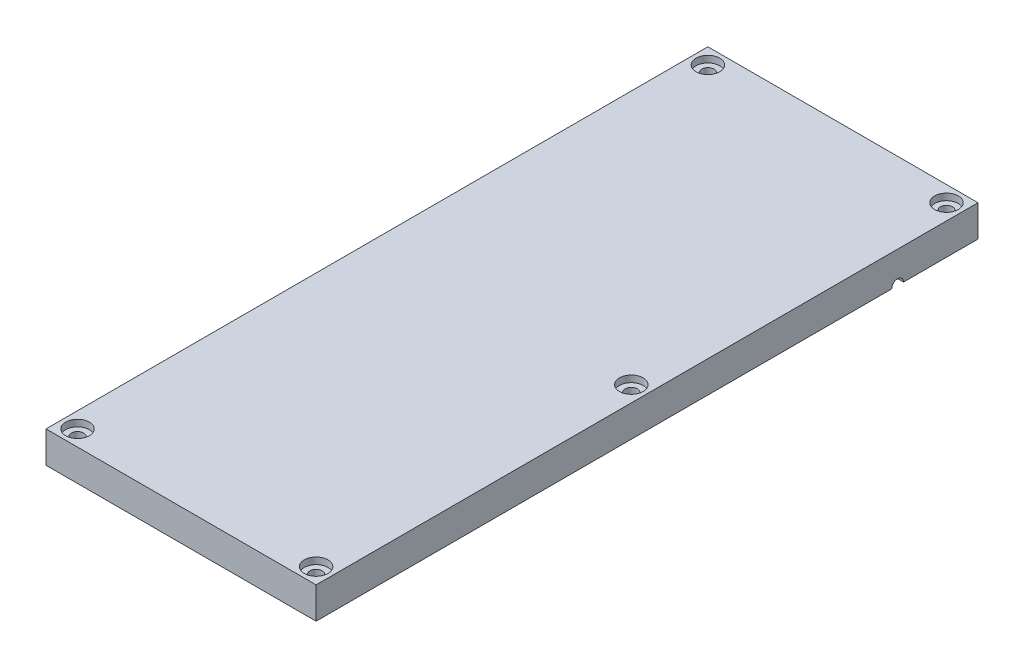
ISO-10303-21;
HEADER;
FILE_DESCRIPTION(('STEP AP214'),'2;1');
FILE_NAME('part.step','',(''),(''),'','','');
FILE_SCHEMA(('AUTOMOTIVE_DESIGN { 1 0 10303 214 1 1 1 1 }'));
ENDSEC;
DATA;
#1=APPLICATION_CONTEXT('core data for automotive mechanical design processes');
#2=APPLICATION_PROTOCOL_DEFINITION('international standard','automotive_design',2000,#1);
#3=PRODUCT_CONTEXT('',#1,'mechanical');
#4=PRODUCT('Part','Part','',(#3));
#5=PRODUCT_RELATED_PRODUCT_CATEGORY('part','',(#4));
#6=PRODUCT_DEFINITION_FORMATION('','',#4);
#7=PRODUCT_DEFINITION_CONTEXT('part definition',#1,'design');
#8=PRODUCT_DEFINITION('design','',#6,#7);
#9=PRODUCT_DEFINITION_SHAPE('','',#8);
#10=(LENGTH_UNIT() NAMED_UNIT(*) SI_UNIT(.MILLI.,.METRE.));
#11=(NAMED_UNIT(*) PLANE_ANGLE_UNIT() SI_UNIT($,.RADIAN.));
#12=(NAMED_UNIT(*) SI_UNIT($,.STERADIAN.) SOLID_ANGLE_UNIT());
#13=UNCERTAINTY_MEASURE_WITH_UNIT(LENGTH_MEASURE(1.E-05),#10,'distance_accuracy_value','');
#14=(GEOMETRIC_REPRESENTATION_CONTEXT(3) GLOBAL_UNCERTAINTY_ASSIGNED_CONTEXT((#13)) GLOBAL_UNIT_ASSIGNED_CONTEXT((#10,
#11,#12)) REPRESENTATION_CONTEXT('',''));
#15=CARTESIAN_POINT('',(0.,0.,0.));
#16=DIRECTION('',(0.,0.,1.));
#17=DIRECTION('',(1.,0.,0.));
#18=AXIS2_PLACEMENT_3D('',#15,#16,#17);
#19=CARTESIAN_POINT('',(43.561,22.225,-241.935));
#20=DIRECTION('',(0.,0.,-1.));
#21=DIRECTION('',(-1.,0.,0.));
#22=AXIS2_PLACEMENT_3D('',#19,#20,#21);
#23=PLANE('',#22);
#24=DIRECTION('',(1.,0.,0.));
#25=VECTOR('',#24,1.);
#26=CARTESIAN_POINT('',(43.561,12.7,-241.935));
#27=LINE('',#26,#25);
#28=CARTESIAN_POINT('',(43.561,12.7,-241.935));
#29=VERTEX_POINT('',#28);
#30=CARTESIAN_POINT('',(83.185,12.7,-241.935));
#31=VERTEX_POINT('',#30);
#32=EDGE_CURVE('E300',#29,#31,#27,.T.);
#33=ORIENTED_EDGE('',*,*,#32,.T.);
#34=DIRECTION('',(0.,-1.,0.));
#35=VECTOR('',#34,1.);
#36=CARTESIAN_POINT('',(83.185,22.225,-241.935));
#37=LINE('',#36,#35);
#38=CARTESIAN_POINT('',(83.185,22.225,-241.935));
#39=VERTEX_POINT('',#38);
#40=EDGE_CURVE('E231',#39,#31,#37,.T.);
#41=ORIENTED_EDGE('',*,*,#40,.F.);
#42=DIRECTION('',(1.,0.,0.));
#43=VECTOR('',#42,1.);
#44=CARTESIAN_POINT('',(43.561,22.225,-241.935));
#45=LINE('',#44,#43);
#46=CARTESIAN_POINT('',(43.561,22.225,-241.935));
#47=VERTEX_POINT('',#46);
#48=EDGE_CURVE('E222',#47,#39,#45,.T.);
#49=ORIENTED_EDGE('',*,*,#48,.F.);
#50=DIRECTION('',(0.,-1.,0.));
#51=VECTOR('',#50,1.);
#52=CARTESIAN_POINT('',(43.561,22.225,-241.935));
#53=LINE('',#52,#51);
#54=EDGE_CURVE('E297',#47,#29,#53,.T.);
#55=ORIENTED_EDGE('',*,*,#54,.T.);
#56=EDGE_LOOP('',(#33,#41,#49,#55));
#57=FACE_BOUND('',#56,.T.);
#58=ADVANCED_FACE('F41',(#57),#23,.F.);
#59=CARTESIAN_POINT('',(114.935,22.225,-18.415));
#60=DIRECTION('',(1.,0.,0.));
#61=DIRECTION('',(0.,0.,-1.));
#62=AXIS2_PLACEMENT_3D('',#59,#60,#61);
#63=PLANE('',#62);
#64=DIRECTION('',(0.,0.,1.));
#65=VECTOR('',#64,1.);
#66=CARTESIAN_POINT('',(114.935,22.225,-18.415));
#67=LINE('',#66,#65);
#68=CARTESIAN_POINT('',(114.935,22.225,-56.515));
#69=VERTEX_POINT('',#68);
#70=CARTESIAN_POINT('',(114.935,22.225,-18.415));
#71=VERTEX_POINT('',#70);
#72=EDGE_CURVE('E290',#69,#71,#67,.T.);
#73=ORIENTED_EDGE('',*,*,#72,.F.);
#74=DIRECTION('',(0.,-1.,0.));
#75=VECTOR('',#74,1.);
#76=CARTESIAN_POINT('',(114.935,22.225,-56.515));
#77=LINE('',#76,#75);
#78=CARTESIAN_POINT('',(114.935,12.7,-56.515));
#79=VERTEX_POINT('',#78);
#80=EDGE_CURVE('E252',#69,#79,#77,.T.);
#81=ORIENTED_EDGE('',*,*,#80,.T.);
#82=DIRECTION('',(0.,0.,1.));
#83=VECTOR('',#82,1.);
#84=CARTESIAN_POINT('',(114.935,12.7,-18.415));
#85=LINE('',#84,#83);
#86=CARTESIAN_POINT('',(114.935,12.7,-18.415));
#87=VERTEX_POINT('',#86);
#88=EDGE_CURVE('E303',#79,#87,#85,.T.);
#89=ORIENTED_EDGE('',*,*,#88,.T.);
#90=DIRECTION('',(0.,-1.,0.));
#91=VECTOR('',#90,1.);
#92=CARTESIAN_POINT('',(114.935,22.225,-18.415));
#93=LINE('',#92,#91);
#94=EDGE_CURVE('E313',#71,#87,#93,.T.);
#95=ORIENTED_EDGE('',*,*,#94,.F.);
#96=EDGE_LOOP('',(#73,#81,#89,#95));
#97=FACE_BOUND('',#96,.T.);
#98=ADVANCED_FACE('F493',(#97),#63,.F.);
#99=CARTESIAN_POINT('',(37.211,25.4,0.));
#100=DIRECTION('',(1.,0.,0.));
#101=DIRECTION('',(0.,0.,-1.));
#102=AXIS2_PLACEMENT_3D('',#99,#100,#101);
#103=PLANE('',#102);
#104=DIRECTION('',(0.,0.,1.));
#105=VECTOR('',#104,1.);
#106=CARTESIAN_POINT('',(37.211,12.7,0.));
#107=LINE('',#106,#105);
#108=CARTESIAN_POINT('',(37.211,12.7,-266.7));
#109=VERTEX_POINT('',#108);
#110=CARTESIAN_POINT('',(37.211,12.7,0.));
#111=VERTEX_POINT('',#110);
#112=EDGE_CURVE('E380',#109,#111,#107,.T.);
#113=ORIENTED_EDGE('',*,*,#112,.T.);
#114=DIRECTION('',(0.,-1.,0.));
#115=VECTOR('',#114,1.);
#116=CARTESIAN_POINT('',(37.211,25.4,0.));
#117=LINE('',#116,#115);
#118=CARTESIAN_POINT('',(37.211,25.4,0.));
#119=VERTEX_POINT('',#118);
#120=EDGE_CURVE('E409',#119,#111,#117,.T.);
#121=ORIENTED_EDGE('',*,*,#120,.F.);
#122=DIRECTION('',(0.,0.,1.));
#123=VECTOR('',#122,1.);
#124=CARTESIAN_POINT('',(37.211,25.4,0.));
#125=LINE('',#124,#123);
#126=CARTESIAN_POINT('',(37.211,25.4,-266.7));
#127=VERTEX_POINT('',#126);
#128=EDGE_CURVE('E381',#127,#119,#125,.T.);
#129=ORIENTED_EDGE('',*,*,#128,.F.);
#130=DIRECTION('',(0.,-1.,0.));
#131=VECTOR('',#130,1.);
#132=CARTESIAN_POINT('',(37.211,25.4,-266.7));
#133=LINE('',#132,#131);
#134=EDGE_CURVE('E391',#127,#109,#133,.T.);
#135=ORIENTED_EDGE('',*,*,#134,.T.);
#136=EDGE_LOOP('',(#113,#121,#129,#135));
#137=FACE_BOUND('',#136,.T.);
#138=ADVANCED_FACE('F43',(#137),#103,.F.);
#139=CARTESIAN_POINT('',(37.211,25.4,0.));
#140=DIRECTION('',(0.,0.,-1.));
#141=DIRECTION('',(-1.,0.,0.));
#142=AXIS2_PLACEMENT_3D('',#139,#140,#141);
#143=PLANE('',#142);
#144=DIRECTION('',(1.,0.,0.));
#145=VECTOR('',#144,1.);
#146=CARTESIAN_POINT('',(37.211,12.7,0.));
#147=LINE('',#146,#145);
#148=CARTESIAN_POINT('',(146.05,12.7,0.));
#149=VERTEX_POINT('',#148);
#150=EDGE_CURVE('E394',#111,#149,#147,.T.);
#151=ORIENTED_EDGE('',*,*,#150,.T.);
#152=DIRECTION('',(0.,-1.,0.));
#153=VECTOR('',#152,1.);
#154=CARTESIAN_POINT('',(146.05,25.4,0.));
#155=LINE('',#154,#153);
#156=CARTESIAN_POINT('',(146.05,25.4,0.));
#157=VERTEX_POINT('',#156);
#158=EDGE_CURVE('E406',#157,#149,#155,.T.);
#159=ORIENTED_EDGE('',*,*,#158,.F.);
#160=DIRECTION('',(1.,0.,0.));
#161=VECTOR('',#160,1.);
#162=CARTESIAN_POINT('',(37.211,25.4,0.));
#163=LINE('',#162,#161);
#164=EDGE_CURVE('E384',#119,#157,#163,.T.);
#165=ORIENTED_EDGE('',*,*,#164,.F.);
#166=ORIENTED_EDGE('',*,*,#120,.T.);
#167=EDGE_LOOP('',(#151,#159,#165,#166));
#168=FACE_BOUND('',#167,.T.);
#169=ADVANCED_FACE('F634',(#168),#143,.F.);
#170=CARTESIAN_POINT('',(146.05,25.4,0.));
#171=DIRECTION('',(-1.,0.,0.));
#172=DIRECTION('',(0.,0.,1.));
#173=AXIS2_PLACEMENT_3D('',#170,#171,#172);
#174=PLANE('',#173);
#175=DIRECTION('',(0.,0.,-1.));
#176=VECTOR('',#175,1.);
#177=CARTESIAN_POINT('',(146.05,12.7,0.));
#178=LINE('',#177,#176);
#179=CARTESIAN_POINT('',(146.05,12.7,-231.93375));
#180=VERTEX_POINT('',#179);
#181=EDGE_CURVE('E397',#149,#180,#178,.T.);
#182=ORIENTED_EDGE('',*,*,#181,.T.);
#183=CARTESIAN_POINT('',(146.05,12.7,-234.315));
#184=DIRECTION('',(1.,0.,0.));
#185=DIRECTION('',(0.,0.,-1.));
#186=AXIS2_PLACEMENT_3D('',#183,#184,#185);
#187=CIRCLE('',#186,2.38125000000001);
#188=CARTESIAN_POINT('',(146.05,12.7,-236.69625));
#189=VERTEX_POINT('',#188);
#190=EDGE_CURVE('E255',#189,#180,#187,.T.);
#191=ORIENTED_EDGE('',*,*,#190,.F.);
#192=CARTESIAN_POINT('',(146.05,12.7,-266.7));
#193=VERTEX_POINT('',#192);
#194=EDGE_CURVE('E396',#189,#193,#178,.T.);
#195=ORIENTED_EDGE('',*,*,#194,.T.);
#196=DIRECTION('',(0.,-1.,0.));
#197=VECTOR('',#196,1.);
#198=CARTESIAN_POINT('',(146.05,25.4,-266.7));
#199=LINE('',#198,#197);
#200=CARTESIAN_POINT('',(146.05,25.4,-266.7));
#201=VERTEX_POINT('',#200);
#202=EDGE_CURVE('E403',#201,#193,#199,.T.);
#203=ORIENTED_EDGE('',*,*,#202,.F.);
#204=DIRECTION('',(0.,0.,-1.));
#205=VECTOR('',#204,1.);
#206=CARTESIAN_POINT('',(146.05,25.4,0.));
#207=LINE('',#206,#205);
#208=EDGE_CURVE('E387',#157,#201,#207,.T.);
#209=ORIENTED_EDGE('',*,*,#208,.F.);
#210=ORIENTED_EDGE('',*,*,#158,.T.);
#211=EDGE_LOOP('',(#182,#191,#195,#203,#209,#210));
#212=FACE_BOUND('',#211,.T.);
#213=ADVANCED_FACE('F631',(#212),#174,.F.);
#214=CARTESIAN_POINT('',(37.211,25.4,-266.7));
#215=DIRECTION('',(0.,0.,1.));
#216=DIRECTION('',(1.,0.,0.));
#217=AXIS2_PLACEMENT_3D('',#214,#215,#216);
#218=PLANE('',#217);
#219=DIRECTION('',(-1.,0.,0.));
#220=VECTOR('',#219,1.);
#221=CARTESIAN_POINT('',(37.211,12.7,-266.7));
#222=LINE('',#221,#220);
#223=EDGE_CURVE('E385',#193,#109,#222,.T.);
#224=ORIENTED_EDGE('',*,*,#223,.T.);
#225=ORIENTED_EDGE('',*,*,#134,.F.);
#226=DIRECTION('',(-1.,0.,0.));
#227=VECTOR('',#226,1.);
#228=CARTESIAN_POINT('',(37.211,25.4,-266.7));
#229=LINE('',#228,#227);
#230=EDGE_CURVE('E389',#201,#127,#229,.T.);
#231=ORIENTED_EDGE('',*,*,#230,.F.);
#232=ORIENTED_EDGE('',*,*,#202,.T.);
#233=EDGE_LOOP('',(#224,#225,#231,#232));
#234=FACE_BOUND('',#233,.T.);
#235=ADVANCED_FACE('F625',(#234),#218,.F.);
#236=CARTESIAN_POINT('',(0.,25.4,0.));
#237=DIRECTION('',(0.,-1.,0.));
#238=DIRECTION('',(0.,0.,-1.));
#239=AXIS2_PLACEMENT_3D('',#236,#237,#238);
#240=PLANE('',#239);
#241=CARTESIAN_POINT('',(139.7,25.4,-6.35));
#242=DIRECTION('',(0.,1.,0.));
#243=DIRECTION('',(0.,0.,1.));
#244=AXIS2_PLACEMENT_3D('',#241,#242,#243);
#245=CIRCLE('',#244,4.7625);
#246=CARTESIAN_POINT('',(139.7,25.4,-1.5875));
#247=VERTEX_POINT('',#246);
#248=EDGE_CURVE('E312',#247,#247,#245,.T.);
#249=ORIENTED_EDGE('',*,*,#248,.F.);
#250=EDGE_LOOP('',(#249));
#251=FACE_BOUND('',#250,.T.);
#252=CARTESIAN_POINT('',(139.7,25.4,-260.35));
#253=DIRECTION('',(0.,1.,0.));
#254=DIRECTION('',(0.,0.,1.));
#255=AXIS2_PLACEMENT_3D('',#252,#253,#254);
#256=CIRCLE('',#255,4.7625);
#257=CARTESIAN_POINT('',(139.7,25.4,-255.5875));
#258=VERTEX_POINT('',#257);
#259=EDGE_CURVE('E332',#258,#258,#256,.T.);
#260=ORIENTED_EDGE('',*,*,#259,.F.);
#261=EDGE_LOOP('',(#260));
#262=FACE_BOUND('',#261,.T.);
#263=CARTESIAN_POINT('',(43.561,25.4,-6.35));
#264=DIRECTION('',(0.,1.,0.));
#265=DIRECTION('',(0.,0.,1.));
#266=AXIS2_PLACEMENT_3D('',#263,#264,#265);
#267=CIRCLE('',#266,4.7625);
#268=CARTESIAN_POINT('',(43.561,25.4,-1.5875));
#269=VERTEX_POINT('',#268);
#270=EDGE_CURVE('E344',#269,#269,#267,.T.);
#271=ORIENTED_EDGE('',*,*,#270,.F.);
#272=EDGE_LOOP('',(#271));
#273=FACE_BOUND('',#272,.T.);
#274=CARTESIAN_POINT('',(43.561,25.4,-260.35));
#275=DIRECTION('',(0.,1.,0.));
#276=DIRECTION('',(0.,0.,1.));
#277=AXIS2_PLACEMENT_3D('',#274,#275,#276);
#278=CIRCLE('',#277,4.7625);
#279=CARTESIAN_POINT('',(43.561,25.4,-255.5875));
#280=VERTEX_POINT('',#279);
#281=EDGE_CURVE('E356',#280,#280,#278,.T.);
#282=ORIENTED_EDGE('',*,*,#281,.F.);
#283=EDGE_LOOP('',(#282));
#284=FACE_BOUND('',#283,.T.);
#285=CARTESIAN_POINT('',(139.7,25.4,-133.35));
#286=DIRECTION('',(0.,1.,0.));
#287=DIRECTION('',(0.,0.,1.));
#288=AXIS2_PLACEMENT_3D('',#285,#286,#287);
#289=CIRCLE('',#288,4.7625);
#290=CARTESIAN_POINT('',(139.7,25.4,-128.5875));
#291=VERTEX_POINT('',#290);
#292=EDGE_CURVE('E368',#291,#291,#289,.T.);
#293=ORIENTED_EDGE('',*,*,#292,.F.);
#294=EDGE_LOOP('',(#293));
#295=FACE_BOUND('',#294,.T.);
#296=ORIENTED_EDGE('',*,*,#128,.T.);
#297=ORIENTED_EDGE('',*,*,#164,.T.);
#298=ORIENTED_EDGE('',*,*,#208,.T.);
#299=ORIENTED_EDGE('',*,*,#230,.T.);
#300=EDGE_LOOP('',(#296,#297,#298,#299));
#301=FACE_BOUND('',#300,.T.);
#302=ADVANCED_FACE('F622',(#251,#262,#273,#284,#295,#301),#240,.F.);
#303=CARTESIAN_POINT('',(0.,12.7,0.));
#304=DIRECTION('',(0.,-1.,0.));
#305=DIRECTION('',(0.,0.,-1.));
#306=AXIS2_PLACEMENT_3D('',#303,#304,#305);
#307=PLANE('',#306);
#308=DIRECTION('',(0.,0.,-1.));
#309=VECTOR('',#308,1.);
#310=CARTESIAN_POINT('',(83.185,12.7,-241.935));
#311=LINE('',#310,#309);
#312=CARTESIAN_POINT('',(83.185,12.7,-254.635));
#313=VERTEX_POINT('',#312);
#314=EDGE_CURVE('E209',#31,#313,#311,.T.);
#315=ORIENTED_EDGE('',*,*,#314,.F.);
#316=ORIENTED_EDGE('',*,*,#32,.F.);
#317=DIRECTION('',(0.,0.,-1.));
#318=VECTOR('',#317,1.);
#319=CARTESIAN_POINT('',(43.561,12.7,-18.415));
#320=LINE('',#319,#318);
#321=CARTESIAN_POINT('',(43.561,12.7,-18.415));
#322=VERTEX_POINT('',#321);
#323=EDGE_CURVE('E284',#322,#29,#320,.T.);
#324=ORIENTED_EDGE('',*,*,#323,.F.);
#325=DIRECTION('',(-1.,0.,0.));
#326=VECTOR('',#325,1.);
#327=CARTESIAN_POINT('',(43.561,12.7,-18.415));
#328=LINE('',#327,#326);
#329=EDGE_CURVE('E288',#87,#322,#328,.T.);
#330=ORIENTED_EDGE('',*,*,#329,.F.);
#331=ORIENTED_EDGE('',*,*,#88,.F.);
#332=DIRECTION('',(-1.,0.,0.));
#333=VECTOR('',#332,1.);
#334=CARTESIAN_POINT('',(114.935,12.7,-56.515));
#335=LINE('',#334,#333);
#336=CARTESIAN_POINT('',(127.635,12.7,-56.515));
#337=VERTEX_POINT('',#336);
#338=EDGE_CURVE('E242',#337,#79,#335,.T.);
#339=ORIENTED_EDGE('',*,*,#338,.F.);
#340=DIRECTION('',(0.,0.,1.));
#341=VECTOR('',#340,1.);
#342=CARTESIAN_POINT('',(127.635,12.7,-56.515));
#343=LINE('',#342,#341);
#344=CARTESIAN_POINT('',(127.635,12.7,-69.215));
#345=VERTEX_POINT('',#344);
#346=EDGE_CURVE('E248',#345,#337,#343,.T.);
#347=ORIENTED_EDGE('',*,*,#346,.F.);
#348=DIRECTION('',(1.,0.,0.));
#349=VECTOR('',#348,1.);
#350=CARTESIAN_POINT('',(114.935,12.7,-69.215));
#351=LINE('',#350,#349);
#352=CARTESIAN_POINT('',(114.935,12.7,-69.215));
#353=VERTEX_POINT('',#352);
#354=EDGE_CURVE('E233',#353,#345,#351,.T.);
#355=ORIENTED_EDGE('',*,*,#354,.F.);
#356=CARTESIAN_POINT('',(114.935,12.7,-193.83375));
#357=VERTEX_POINT('',#356);
#358=EDGE_CURVE('E307',#357,#353,#85,.T.);
#359=ORIENTED_EDGE('',*,*,#358,.F.);
#360=DIRECTION('',(-1.,0.,0.));
#361=VECTOR('',#360,1.);
#362=CARTESIAN_POINT('',(120.015,12.7,-193.83375));
#363=LINE('',#362,#361);
#364=CARTESIAN_POINT('',(122.39625,12.7,-193.83375));
#365=VERTEX_POINT('',#364);
#366=EDGE_CURVE('E282',#365,#357,#363,.T.);
#367=ORIENTED_EDGE('',*,*,#366,.F.);
#368=DIRECTION('',(0.,0.,1.));
#369=VECTOR('',#368,1.);
#370=CARTESIAN_POINT('',(122.39625,12.7,-234.315));
#371=LINE('',#370,#369);
#372=CARTESIAN_POINT('',(122.39625,12.7,-231.93375));
#373=VERTEX_POINT('',#372);
#374=EDGE_CURVE('E427',#365,#373,#371,.F.);
#375=ORIENTED_EDGE('',*,*,#374,.T.);
#376=DIRECTION('',(-1.,0.,0.));
#377=VECTOR('',#376,1.);
#378=CARTESIAN_POINT('',(128.905,12.7,-231.93375));
#379=LINE('',#378,#377);
#380=CARTESIAN_POINT('',(126.52375,12.7,-231.93375));
#381=VERTEX_POINT('',#380);
#382=EDGE_CURVE('E425',#381,#373,#379,.T.);
#383=ORIENTED_EDGE('',*,*,#382,.F.);
#384=DIRECTION('',(0.,0.,-1.));
#385=VECTOR('',#384,1.);
#386=CARTESIAN_POINT('',(126.52375,12.7,-158.115));
#387=LINE('',#386,#385);
#388=CARTESIAN_POINT('',(126.52375,12.7,-155.73375));
#389=VERTEX_POINT('',#388);
#390=EDGE_CURVE('E422',#381,#389,#387,.F.);
#391=ORIENTED_EDGE('',*,*,#390,.T.);
#392=DIRECTION('',(-1.,0.,0.));
#393=VECTOR('',#392,1.);
#394=CARTESIAN_POINT('',(137.795,12.7,-155.73375));
#395=LINE('',#394,#393);
#396=CARTESIAN_POINT('',(140.17625,12.7,-155.73375));
#397=VERTEX_POINT('',#396);
#398=EDGE_CURVE('E420',#397,#389,#395,.T.);
#399=ORIENTED_EDGE('',*,*,#398,.F.);
#400=DIRECTION('',(0.,0.,1.));
#401=VECTOR('',#400,1.);
#402=CARTESIAN_POINT('',(140.17625,12.7,-234.315));
#403=LINE('',#402,#401);
#404=CARTESIAN_POINT('',(140.17625,12.7,-231.93375));
#405=VERTEX_POINT('',#404);
#406=EDGE_CURVE('E417',#397,#405,#403,.F.);
#407=ORIENTED_EDGE('',*,*,#406,.T.);
#408=DIRECTION('',(1.,0.,0.));
#409=VECTOR('',#408,1.);
#410=CARTESIAN_POINT('',(131.059807909198,12.7,-231.93375));
#411=LINE('',#410,#409);
#412=EDGE_CURVE('E415',#180,#405,#411,.F.);
#413=ORIENTED_EDGE('',*,*,#412,.F.);
#414=ORIENTED_EDGE('',*,*,#181,.F.);
#415=ORIENTED_EDGE('',*,*,#150,.F.);
#416=ORIENTED_EDGE('',*,*,#112,.F.);
#417=ORIENTED_EDGE('',*,*,#223,.F.);
#418=ORIENTED_EDGE('',*,*,#194,.F.);
#419=DIRECTION('',(1.,0.,0.));
#420=VECTOR('',#419,1.);
#421=CARTESIAN_POINT('',(131.059807909198,12.7,-236.69625));
#422=LINE('',#421,#420);
#423=CARTESIAN_POINT('',(135.41375,12.7,-236.69625));
#424=VERTEX_POINT('',#423);
#425=EDGE_CURVE('E430',#424,#189,#422,.T.);
#426=ORIENTED_EDGE('',*,*,#425,.F.);
#427=DIRECTION('',(0.,0.,1.));
#428=VECTOR('',#427,1.);
#429=CARTESIAN_POINT('',(135.41375,12.7,-234.315));
#430=LINE('',#429,#428);
#431=CARTESIAN_POINT('',(135.41375,12.7,-160.49625));
#432=VERTEX_POINT('',#431);
#433=EDGE_CURVE('E432',#424,#432,#430,.T.);
#434=ORIENTED_EDGE('',*,*,#433,.T.);
#435=DIRECTION('',(-1.,0.,0.));
#436=VECTOR('',#435,1.);
#437=CARTESIAN_POINT('',(137.795,12.7,-160.49625));
#438=LINE('',#437,#436);
#439=CARTESIAN_POINT('',(131.28625,12.7,-160.49625));
#440=VERTEX_POINT('',#439);
#441=EDGE_CURVE('E435',#440,#432,#438,.F.);
#442=ORIENTED_EDGE('',*,*,#441,.F.);
#443=DIRECTION('',(0.,0.,-1.));
#444=VECTOR('',#443,1.);
#445=CARTESIAN_POINT('',(131.28625,12.7,-158.115));
#446=LINE('',#445,#444);
#447=CARTESIAN_POINT('',(131.28625,12.7,-236.69625));
#448=VERTEX_POINT('',#447);
#449=EDGE_CURVE('E437',#440,#448,#446,.T.);
#450=ORIENTED_EDGE('',*,*,#449,.T.);
#451=DIRECTION('',(-1.,0.,0.));
#452=VECTOR('',#451,1.);
#453=CARTESIAN_POINT('',(128.905,12.7,-236.69625));
#454=LINE('',#453,#452);
#455=CARTESIAN_POINT('',(117.63375,12.7,-236.69625));
#456=VERTEX_POINT('',#455);
#457=EDGE_CURVE('E49',#456,#448,#454,.F.);
#458=ORIENTED_EDGE('',*,*,#457,.F.);
#459=DIRECTION('',(0.,0.,1.));
#460=VECTOR('',#459,1.);
#461=CARTESIAN_POINT('',(117.63375,12.7,-234.315));
#462=LINE('',#461,#460);
#463=CARTESIAN_POINT('',(117.63375,12.7,-198.59625));
#464=VERTEX_POINT('',#463);
#465=EDGE_CURVE('E12',#456,#464,#462,.T.);
#466=ORIENTED_EDGE('',*,*,#465,.T.);
#467=DIRECTION('',(-1.,0.,0.));
#468=VECTOR('',#467,1.);
#469=CARTESIAN_POINT('',(120.015,12.7,-198.59625));
#470=LINE('',#469,#468);
#471=CARTESIAN_POINT('',(114.935,12.7,-198.59625));
#472=VERTEX_POINT('',#471);
#473=EDGE_CURVE('E280',#472,#464,#470,.F.);
#474=ORIENTED_EDGE('',*,*,#473,.F.);
#475=CARTESIAN_POINT('',(114.935,12.7,-241.935));
#476=VERTEX_POINT('',#475);
#477=EDGE_CURVE('E304',#476,#472,#85,.T.);
#478=ORIENTED_EDGE('',*,*,#477,.F.);
#479=CARTESIAN_POINT('',(95.885,12.7,-241.935));
#480=VERTEX_POINT('',#479);
#481=EDGE_CURVE('E299',#480,#476,#27,.T.);
#482=ORIENTED_EDGE('',*,*,#481,.F.);
#483=DIRECTION('',(0.,0.,1.));
#484=VECTOR('',#483,1.);
#485=CARTESIAN_POINT('',(95.885,12.7,-241.935));
#486=LINE('',#485,#484);
#487=CARTESIAN_POINT('',(95.885,12.7,-254.635));
#488=VERTEX_POINT('',#487);
#489=EDGE_CURVE('E223',#488,#480,#486,.T.);
#490=ORIENTED_EDGE('',*,*,#489,.F.);
#491=DIRECTION('',(1.,0.,0.));
#492=VECTOR('',#491,1.);
#493=CARTESIAN_POINT('',(83.185,12.7,-254.635));
#494=LINE('',#493,#492);
#495=EDGE_CURVE('E225',#313,#488,#494,.T.);
#496=ORIENTED_EDGE('',*,*,#495,.F.);
#497=EDGE_LOOP('',(#315,#316,#324,#330,#331,#339,#347,#355,#359,#367,#375,#383,#391,#399,#407,
#413,#414,#415,#416,#417,#418,#426,#434,#442,#450,#458,#466,#474,#478,#482,#490,#496));
#498=FACE_BOUND('',#497,.T.);
#499=CARTESIAN_POINT('',(139.7,12.7,-6.35));
#500=DIRECTION('',(0.,1.,0.));
#501=DIRECTION('',(0.,0.,1.));
#502=AXIS2_PLACEMENT_3D('',#499,#500,#501);
#503=CIRCLE('',#502,2.45745);
#504=CARTESIAN_POINT('',(139.7,12.7,-3.89255));
#505=VERTEX_POINT('',#504);
#506=EDGE_CURVE('E329',#505,#505,#503,.T.);
#507=ORIENTED_EDGE('',*,*,#506,.T.);
#508=EDGE_LOOP('',(#507));
#509=FACE_BOUND('',#508,.T.);
#510=CARTESIAN_POINT('',(139.7,12.7,-260.35));
#511=DIRECTION('',(0.,1.,0.));
#512=DIRECTION('',(0.,0.,1.));
#513=AXIS2_PLACEMENT_3D('',#510,#511,#512);
#514=CIRCLE('',#513,2.45745);
#515=CARTESIAN_POINT('',(139.7,12.7,-257.89255));
#516=VERTEX_POINT('',#515);
#517=EDGE_CURVE('E341',#516,#516,#514,.T.);
#518=ORIENTED_EDGE('',*,*,#517,.T.);
#519=EDGE_LOOP('',(#518));
#520=FACE_BOUND('',#519,.T.);
#521=CARTESIAN_POINT('',(43.561,12.7,-6.35));
#522=DIRECTION('',(0.,1.,0.));
#523=DIRECTION('',(0.,0.,1.));
#524=AXIS2_PLACEMENT_3D('',#521,#522,#523);
#525=CIRCLE('',#524,2.45745);
#526=CARTESIAN_POINT('',(43.561,12.7,-3.89255));
#527=VERTEX_POINT('',#526);
#528=EDGE_CURVE('E353',#527,#527,#525,.T.);
#529=ORIENTED_EDGE('',*,*,#528,.T.);
#530=EDGE_LOOP('',(#529));
#531=FACE_BOUND('',#530,.T.);
#532=CARTESIAN_POINT('',(43.561,12.7,-260.35));
#533=DIRECTION('',(0.,1.,0.));
#534=DIRECTION('',(0.,0.,1.));
#535=AXIS2_PLACEMENT_3D('',#532,#533,#534);
#536=CIRCLE('',#535,2.45745);
#537=CARTESIAN_POINT('',(43.561,12.7,-257.89255));
#538=VERTEX_POINT('',#537);
#539=EDGE_CURVE('E365',#538,#538,#536,.T.);
#540=ORIENTED_EDGE('',*,*,#539,.T.);
#541=EDGE_LOOP('',(#540));
#542=FACE_BOUND('',#541,.T.);
#543=CARTESIAN_POINT('',(139.7,12.7,-133.35));
#544=DIRECTION('',(0.,1.,0.));
#545=DIRECTION('',(0.,0.,1.));
#546=AXIS2_PLACEMENT_3D('',#543,#544,#545);
#547=CIRCLE('',#546,2.45745);
#548=CARTESIAN_POINT('',(139.7,12.7,-130.89255));
#549=VERTEX_POINT('',#548);
#550=EDGE_CURVE('E377',#549,#549,#547,.T.);
#551=ORIENTED_EDGE('',*,*,#550,.T.);
#552=EDGE_LOOP('',(#551));
#553=FACE_BOUND('',#552,.T.);
#554=ADVANCED_FACE('F450',(#498,#509,#520,#531,#542,#553),#307,.T.);
#555=CARTESIAN_POINT('',(139.7,25.4,-133.35));
#556=DIRECTION('',(0.,1.,0.));
#557=DIRECTION('',(0.,0.,1.));
#558=AXIS2_PLACEMENT_3D('',#555,#556,#557);
#559=CYLINDRICAL_SURFACE('',#558,2.45745);
#560=ORIENTED_EDGE('',*,*,#550,.F.);
#561=EDGE_LOOP('',(#560));
#562=FACE_BOUND('',#561,.T.);
#563=CARTESIAN_POINT('',(139.7,22.733,-133.35));
#564=DIRECTION('',(0.,1.,0.));
#565=DIRECTION('',(0.,0.,1.));
#566=AXIS2_PLACEMENT_3D('',#563,#564,#565);
#567=CIRCLE('',#566,2.45745);
#568=CARTESIAN_POINT('',(139.7,22.733,-130.89255));
#569=VERTEX_POINT('',#568);
#570=EDGE_CURVE('E374',#569,#569,#567,.T.);
#571=ORIENTED_EDGE('',*,*,#570,.T.);
#572=EDGE_LOOP('',(#571));
#573=FACE_BOUND('',#572,.T.);
#574=ADVANCED_FACE('F617',(#562,#573),#559,.F.);
#575=CARTESIAN_POINT('',(142.15745,22.733,-133.35));
#576=DIRECTION('',(0.,-1.,0.));
#577=DIRECTION('',(0.,0.,-1.));
#578=AXIS2_PLACEMENT_3D('',#575,#576,#577);
#579=PLANE('',#578);
#580=ORIENTED_EDGE('',*,*,#570,.F.);
#581=EDGE_LOOP('',(#580));
#582=FACE_BOUND('',#581,.T.);
#583=CARTESIAN_POINT('',(139.7,22.733,-133.35));
#584=DIRECTION('',(0.,1.,0.));
#585=DIRECTION('',(0.,0.,1.));
#586=AXIS2_PLACEMENT_3D('',#583,#584,#585);
#587=CIRCLE('',#586,4.7625);
#588=CARTESIAN_POINT('',(139.7,22.733,-128.5875));
#589=VERTEX_POINT('',#588);
#590=EDGE_CURVE('E371',#589,#589,#587,.T.);
#591=ORIENTED_EDGE('',*,*,#590,.T.);
#592=EDGE_LOOP('',(#591));
#593=FACE_BOUND('',#592,.T.);
#594=ADVANCED_FACE('F613',(#582,#593),#579,.F.);
#595=CARTESIAN_POINT('',(139.7,25.4,-133.35));
#596=DIRECTION('',(0.,1.,0.));
#597=DIRECTION('',(0.,0.,1.));
#598=AXIS2_PLACEMENT_3D('',#595,#596,#597);
#599=CYLINDRICAL_SURFACE('',#598,4.7625);
#600=ORIENTED_EDGE('',*,*,#590,.F.);
#601=EDGE_LOOP('',(#600));
#602=FACE_BOUND('',#601,.T.);
#603=ORIENTED_EDGE('',*,*,#292,.T.);
#604=EDGE_LOOP('',(#603));
#605=FACE_BOUND('',#604,.T.);
#606=ADVANCED_FACE('F609',(#602,#605),#599,.F.);
#607=CARTESIAN_POINT('',(43.561,25.4,-260.35));
#608=DIRECTION('',(0.,1.,0.));
#609=DIRECTION('',(0.,0.,1.));
#610=AXIS2_PLACEMENT_3D('',#607,#608,#609);
#611=CYLINDRICAL_SURFACE('',#610,2.45745);
#612=ORIENTED_EDGE('',*,*,#539,.F.);
#613=EDGE_LOOP('',(#612));
#614=FACE_BOUND('',#613,.T.);
#615=CARTESIAN_POINT('',(43.561,22.733,-260.35));
#616=DIRECTION('',(0.,1.,0.));
#617=DIRECTION('',(0.,0.,1.));
#618=AXIS2_PLACEMENT_3D('',#615,#616,#617);
#619=CIRCLE('',#618,2.45745);
#620=CARTESIAN_POINT('',(43.561,22.733,-257.89255));
#621=VERTEX_POINT('',#620);
#622=EDGE_CURVE('E362',#621,#621,#619,.T.);
#623=ORIENTED_EDGE('',*,*,#622,.T.);
#624=EDGE_LOOP('',(#623));
#625=FACE_BOUND('',#624,.T.);
#626=ADVANCED_FACE('F605',(#614,#625),#611,.F.);
#627=CARTESIAN_POINT('',(46.01845,22.733,-260.35));
#628=DIRECTION('',(0.,-1.,0.));
#629=DIRECTION('',(0.,0.,-1.));
#630=AXIS2_PLACEMENT_3D('',#627,#628,#629);
#631=PLANE('',#630);
#632=ORIENTED_EDGE('',*,*,#622,.F.);
#633=EDGE_LOOP('',(#632));
#634=FACE_BOUND('',#633,.T.);
#635=CARTESIAN_POINT('',(43.561,22.733,-260.35));
#636=DIRECTION('',(0.,1.,0.));
#637=DIRECTION('',(0.,0.,1.));
#638=AXIS2_PLACEMENT_3D('',#635,#636,#637);
#639=CIRCLE('',#638,4.7625);
#640=CARTESIAN_POINT('',(43.561,22.733,-255.5875));
#641=VERTEX_POINT('',#640);
#642=EDGE_CURVE('E359',#641,#641,#639,.T.);
#643=ORIENTED_EDGE('',*,*,#642,.T.);
#644=EDGE_LOOP('',(#643));
#645=FACE_BOUND('',#644,.T.);
#646=ADVANCED_FACE('F601',(#634,#645),#631,.F.);
#647=CARTESIAN_POINT('',(43.561,25.4,-260.35));
#648=DIRECTION('',(0.,1.,0.));
#649=DIRECTION('',(0.,0.,1.));
#650=AXIS2_PLACEMENT_3D('',#647,#648,#649);
#651=CYLINDRICAL_SURFACE('',#650,4.7625);
#652=ORIENTED_EDGE('',*,*,#642,.F.);
#653=EDGE_LOOP('',(#652));
#654=FACE_BOUND('',#653,.T.);
#655=ORIENTED_EDGE('',*,*,#281,.T.);
#656=EDGE_LOOP('',(#655));
#657=FACE_BOUND('',#656,.T.);
#658=ADVANCED_FACE('F597',(#654,#657),#651,.F.);
#659=CARTESIAN_POINT('',(43.561,25.4,-6.35));
#660=DIRECTION('',(0.,1.,0.));
#661=DIRECTION('',(0.,0.,1.));
#662=AXIS2_PLACEMENT_3D('',#659,#660,#661);
#663=CYLINDRICAL_SURFACE('',#662,2.45745);
#664=ORIENTED_EDGE('',*,*,#528,.F.);
#665=EDGE_LOOP('',(#664));
#666=FACE_BOUND('',#665,.T.);
#667=CARTESIAN_POINT('',(43.561,22.733,-6.35));
#668=DIRECTION('',(0.,1.,0.));
#669=DIRECTION('',(0.,0.,1.));
#670=AXIS2_PLACEMENT_3D('',#667,#668,#669);
#671=CIRCLE('',#670,2.45745);
#672=CARTESIAN_POINT('',(43.561,22.733,-3.89255));
#673=VERTEX_POINT('',#672);
#674=EDGE_CURVE('E350',#673,#673,#671,.T.);
#675=ORIENTED_EDGE('',*,*,#674,.T.);
#676=EDGE_LOOP('',(#675));
#677=FACE_BOUND('',#676,.T.);
#678=ADVANCED_FACE('F593',(#666,#677),#663,.F.);
#679=CARTESIAN_POINT('',(46.01845,22.733,-6.35));
#680=DIRECTION('',(0.,-1.,0.));
#681=DIRECTION('',(0.,0.,-1.));
#682=AXIS2_PLACEMENT_3D('',#679,#680,#681);
#683=PLANE('',#682);
#684=ORIENTED_EDGE('',*,*,#674,.F.);
#685=EDGE_LOOP('',(#684));
#686=FACE_BOUND('',#685,.T.);
#687=CARTESIAN_POINT('',(43.561,22.733,-6.35));
#688=DIRECTION('',(0.,1.,0.));
#689=DIRECTION('',(0.,0.,1.));
#690=AXIS2_PLACEMENT_3D('',#687,#688,#689);
#691=CIRCLE('',#690,4.7625);
#692=CARTESIAN_POINT('',(43.561,22.733,-1.5875));
#693=VERTEX_POINT('',#692);
#694=EDGE_CURVE('E347',#693,#693,#691,.T.);
#695=ORIENTED_EDGE('',*,*,#694,.T.);
#696=EDGE_LOOP('',(#695));
#697=FACE_BOUND('',#696,.T.);
#698=ADVANCED_FACE('F589',(#686,#697),#683,.F.);
#699=CARTESIAN_POINT('',(43.561,25.4,-6.35));
#700=DIRECTION('',(0.,1.,0.));
#701=DIRECTION('',(0.,0.,1.));
#702=AXIS2_PLACEMENT_3D('',#699,#700,#701);
#703=CYLINDRICAL_SURFACE('',#702,4.7625);
#704=ORIENTED_EDGE('',*,*,#694,.F.);
#705=EDGE_LOOP('',(#704));
#706=FACE_BOUND('',#705,.T.);
#707=ORIENTED_EDGE('',*,*,#270,.T.);
#708=EDGE_LOOP('',(#707));
#709=FACE_BOUND('',#708,.T.);
#710=ADVANCED_FACE('F585',(#706,#709),#703,.F.);
#711=CARTESIAN_POINT('',(139.7,25.4,-260.35));
#712=DIRECTION('',(0.,1.,0.));
#713=DIRECTION('',(0.,0.,1.));
#714=AXIS2_PLACEMENT_3D('',#711,#712,#713);
#715=CYLINDRICAL_SURFACE('',#714,2.45745);
#716=ORIENTED_EDGE('',*,*,#517,.F.);
#717=EDGE_LOOP('',(#716));
#718=FACE_BOUND('',#717,.T.);
#719=CARTESIAN_POINT('',(139.7,22.733,-260.35));
#720=DIRECTION('',(0.,1.,0.));
#721=DIRECTION('',(0.,0.,1.));
#722=AXIS2_PLACEMENT_3D('',#719,#720,#721);
#723=CIRCLE('',#722,2.45745);
#724=CARTESIAN_POINT('',(139.7,22.733,-257.89255));
#725=VERTEX_POINT('',#724);
#726=EDGE_CURVE('E338',#725,#725,#723,.T.);
#727=ORIENTED_EDGE('',*,*,#726,.T.);
#728=EDGE_LOOP('',(#727));
#729=FACE_BOUND('',#728,.T.);
#730=ADVANCED_FACE('F581',(#718,#729),#715,.F.);
#731=CARTESIAN_POINT('',(142.15745,22.733,-260.35));
#732=DIRECTION('',(0.,-1.,0.));
#733=DIRECTION('',(0.,0.,-1.));
#734=AXIS2_PLACEMENT_3D('',#731,#732,#733);
#735=PLANE('',#734);
#736=ORIENTED_EDGE('',*,*,#726,.F.);
#737=EDGE_LOOP('',(#736));
#738=FACE_BOUND('',#737,.T.);
#739=CARTESIAN_POINT('',(139.7,22.733,-260.35));
#740=DIRECTION('',(0.,1.,0.));
#741=DIRECTION('',(0.,0.,1.));
#742=AXIS2_PLACEMENT_3D('',#739,#740,#741);
#743=CIRCLE('',#742,4.7625);
#744=CARTESIAN_POINT('',(139.7,22.733,-255.5875));
#745=VERTEX_POINT('',#744);
#746=EDGE_CURVE('E335',#745,#745,#743,.T.);
#747=ORIENTED_EDGE('',*,*,#746,.T.);
#748=EDGE_LOOP('',(#747));
#749=FACE_BOUND('',#748,.T.);
#750=ADVANCED_FACE('F577',(#738,#749),#735,.F.);
#751=CARTESIAN_POINT('',(139.7,25.4,-260.35));
#752=DIRECTION('',(0.,1.,0.));
#753=DIRECTION('',(0.,0.,1.));
#754=AXIS2_PLACEMENT_3D('',#751,#752,#753);
#755=CYLINDRICAL_SURFACE('',#754,4.7625);
#756=ORIENTED_EDGE('',*,*,#746,.F.);
#757=EDGE_LOOP('',(#756));
#758=FACE_BOUND('',#757,.T.);
#759=ORIENTED_EDGE('',*,*,#259,.T.);
#760=EDGE_LOOP('',(#759));
#761=FACE_BOUND('',#760,.T.);
#762=ADVANCED_FACE('F573',(#758,#761),#755,.F.);
#763=CARTESIAN_POINT('',(139.7,25.4,-6.35));
#764=DIRECTION('',(0.,1.,0.));
#765=DIRECTION('',(0.,0.,1.));
#766=AXIS2_PLACEMENT_3D('',#763,#764,#765);
#767=CYLINDRICAL_SURFACE('',#766,2.45745);
#768=ORIENTED_EDGE('',*,*,#506,.F.);
#769=EDGE_LOOP('',(#768));
#770=FACE_BOUND('',#769,.T.);
#771=CARTESIAN_POINT('',(139.7,22.733,-6.35));
#772=DIRECTION('',(0.,1.,0.));
#773=DIRECTION('',(0.,0.,1.));
#774=AXIS2_PLACEMENT_3D('',#771,#772,#773);
#775=CIRCLE('',#774,2.45745);
#776=CARTESIAN_POINT('',(139.7,22.733,-3.89255));
#777=VERTEX_POINT('',#776);
#778=EDGE_CURVE('E326',#777,#777,#775,.T.);
#779=ORIENTED_EDGE('',*,*,#778,.T.);
#780=EDGE_LOOP('',(#779));
#781=FACE_BOUND('',#780,.T.);
#782=ADVANCED_FACE('F569',(#770,#781),#767,.F.);
#783=CARTESIAN_POINT('',(142.15745,22.733,-6.35));
#784=DIRECTION('',(0.,-1.,0.));
#785=DIRECTION('',(0.,0.,-1.));
#786=AXIS2_PLACEMENT_3D('',#783,#784,#785);
#787=PLANE('',#786);
#788=ORIENTED_EDGE('',*,*,#778,.F.);
#789=EDGE_LOOP('',(#788));
#790=FACE_BOUND('',#789,.T.);
#791=CARTESIAN_POINT('',(139.7,22.733,-6.35));
#792=DIRECTION('',(0.,1.,0.));
#793=DIRECTION('',(0.,0.,1.));
#794=AXIS2_PLACEMENT_3D('',#791,#792,#793);
#795=CIRCLE('',#794,4.7625);
#796=CARTESIAN_POINT('',(139.7,22.733,-1.5875));
#797=VERTEX_POINT('',#796);
#798=EDGE_CURVE('E323',#797,#797,#795,.T.);
#799=ORIENTED_EDGE('',*,*,#798,.T.);
#800=EDGE_LOOP('',(#799));
#801=FACE_BOUND('',#800,.T.);
#802=ADVANCED_FACE('F563',(#790,#801),#787,.F.);
#803=CARTESIAN_POINT('',(139.7,25.4,-6.35));
#804=DIRECTION('',(0.,1.,0.));
#805=DIRECTION('',(0.,0.,1.));
#806=AXIS2_PLACEMENT_3D('',#803,#804,#805);
#807=CYLINDRICAL_SURFACE('',#806,4.7625);
#808=ORIENTED_EDGE('',*,*,#798,.F.);
#809=EDGE_LOOP('',(#808));
#810=FACE_BOUND('',#809,.T.);
#811=ORIENTED_EDGE('',*,*,#248,.T.);
#812=EDGE_LOOP('',(#811));
#813=FACE_BOUND('',#812,.T.);
#814=ADVANCED_FACE('F559',(#810,#813),#807,.F.);
#815=CARTESIAN_POINT('',(43.561,22.225,-18.415));
#816=DIRECTION('',(-1.,0.,0.));
#817=DIRECTION('',(0.,0.,1.));
#818=AXIS2_PLACEMENT_3D('',#815,#816,#817);
#819=PLANE('',#818);
#820=ORIENTED_EDGE('',*,*,#323,.T.);
#821=ORIENTED_EDGE('',*,*,#54,.F.);
#822=DIRECTION('',(0.,0.,-1.));
#823=VECTOR('',#822,1.);
#824=CARTESIAN_POINT('',(43.561,22.225,-18.415));
#825=LINE('',#824,#823);
#826=CARTESIAN_POINT('',(43.561,22.225,-18.415));
#827=VERTEX_POINT('',#826);
#828=EDGE_CURVE('E285',#827,#47,#825,.T.);
#829=ORIENTED_EDGE('',*,*,#828,.F.);
#830=DIRECTION('',(0.,-1.,0.));
#831=VECTOR('',#830,1.);
#832=CARTESIAN_POINT('',(43.561,22.225,-18.415));
#833=LINE('',#832,#831);
#834=EDGE_CURVE('E310',#827,#322,#833,.T.);
#835=ORIENTED_EDGE('',*,*,#834,.T.);
#836=EDGE_LOOP('',(#820,#821,#829,#835));
#837=FACE_BOUND('',#836,.T.);
#838=ADVANCED_FACE('F513',(#837),#819,.F.);
#839=CARTESIAN_POINT('',(43.561,22.225,-18.415));
#840=DIRECTION('',(0.,0.,1.));
#841=DIRECTION('',(1.,0.,0.));
#842=AXIS2_PLACEMENT_3D('',#839,#840,#841);
#843=PLANE('',#842);
#844=ORIENTED_EDGE('',*,*,#329,.T.);
#845=ORIENTED_EDGE('',*,*,#834,.F.);
#846=DIRECTION('',(-1.,0.,0.));
#847=VECTOR('',#846,1.);
#848=CARTESIAN_POINT('',(43.561,22.225,-18.415));
#849=LINE('',#848,#847);
#850=EDGE_CURVE('E294',#71,#827,#849,.T.);
#851=ORIENTED_EDGE('',*,*,#850,.F.);
#852=ORIENTED_EDGE('',*,*,#94,.T.);
#853=EDGE_LOOP('',(#844,#845,#851,#852));
#854=FACE_BOUND('',#853,.T.);
#855=ADVANCED_FACE('F509',(#854),#843,.F.);
#856=ORIENTED_EDGE('',*,*,#358,.T.);
#857=DIRECTION('',(0.,-1.,0.));
#858=VECTOR('',#857,1.);
#859=CARTESIAN_POINT('',(114.935,22.225,-69.215));
#860=LINE('',#859,#858);
#861=CARTESIAN_POINT('',(114.935,22.225,-69.215));
#862=VERTEX_POINT('',#861);
#863=EDGE_CURVE('E245',#862,#353,#860,.T.);
#864=ORIENTED_EDGE('',*,*,#863,.F.);
#865=CARTESIAN_POINT('',(114.935,22.225,-241.935));
#866=VERTEX_POINT('',#865);
#867=EDGE_CURVE('E291',#866,#862,#67,.T.);
#868=ORIENTED_EDGE('',*,*,#867,.F.);
#869=DIRECTION('',(0.,-1.,0.));
#870=VECTOR('',#869,1.);
#871=CARTESIAN_POINT('',(114.935,22.225,-241.935));
#872=LINE('',#871,#870);
#873=EDGE_CURVE('E316',#866,#476,#872,.T.);
#874=ORIENTED_EDGE('',*,*,#873,.T.);
#875=ORIENTED_EDGE('',*,*,#477,.T.);
#876=CARTESIAN_POINT('',(114.935,12.7,-196.215));
#877=DIRECTION('',(1.,0.,0.));
#878=DIRECTION('',(0.,0.,-1.));
#879=AXIS2_PLACEMENT_3D('',#876,#877,#878);
#880=CIRCLE('',#879,2.38125000000001);
#881=EDGE_CURVE('E412',#472,#357,#880,.T.);
#882=ORIENTED_EDGE('',*,*,#881,.T.);
#883=EDGE_LOOP('',(#856,#864,#868,#874,#875,#882));
#884=FACE_BOUND('',#883,.T.);
#885=ADVANCED_FACE('F472',(#884),#63,.F.);
#886=CARTESIAN_POINT('',(95.885,22.225,-241.935));
#887=VERTEX_POINT('',#886);
#888=EDGE_CURVE('E287',#887,#866,#45,.T.);
#889=ORIENTED_EDGE('',*,*,#888,.F.);
#890=DIRECTION('',(0.,-1.,0.));
#891=VECTOR('',#890,1.);
#892=CARTESIAN_POINT('',(95.885,22.225,-241.935));
#893=LINE('',#892,#891);
#894=EDGE_CURVE('E234',#887,#480,#893,.T.);
#895=ORIENTED_EDGE('',*,*,#894,.T.);
#896=ORIENTED_EDGE('',*,*,#481,.T.);
#897=ORIENTED_EDGE('',*,*,#873,.F.);
#898=EDGE_LOOP('',(#889,#895,#896,#897));
#899=FACE_BOUND('',#898,.T.);
#900=ADVANCED_FACE('F479',(#899),#23,.F.);
#901=CARTESIAN_POINT('',(0.,22.225,0.));
#902=DIRECTION('',(0.,-1.,0.));
#903=DIRECTION('',(0.,0.,-1.));
#904=AXIS2_PLACEMENT_3D('',#901,#902,#903);
#905=PLANE('',#904);
#906=ORIENTED_EDGE('',*,*,#828,.T.);
#907=ORIENTED_EDGE('',*,*,#48,.T.);
#908=DIRECTION('',(0.,0.,-1.));
#909=VECTOR('',#908,1.);
#910=CARTESIAN_POINT('',(83.185,22.225,-241.935));
#911=LINE('',#910,#909);
#912=CARTESIAN_POINT('',(83.185,22.225,-254.635));
#913=VERTEX_POINT('',#912);
#914=EDGE_CURVE('E206',#39,#913,#911,.T.);
#915=ORIENTED_EDGE('',*,*,#914,.T.);
#916=DIRECTION('',(1.,0.,0.));
#917=VECTOR('',#916,1.);
#918=CARTESIAN_POINT('',(83.185,22.225,-254.635));
#919=LINE('',#918,#917);
#920=CARTESIAN_POINT('',(95.885,22.225,-254.635));
#921=VERTEX_POINT('',#920);
#922=EDGE_CURVE('E215',#913,#921,#919,.T.);
#923=ORIENTED_EDGE('',*,*,#922,.T.);
#924=DIRECTION('',(0.,0.,1.));
#925=VECTOR('',#924,1.);
#926=CARTESIAN_POINT('',(95.885,22.225,-241.935));
#927=LINE('',#926,#925);
#928=EDGE_CURVE('E56',#921,#887,#927,.T.);
#929=ORIENTED_EDGE('',*,*,#928,.T.);
#930=ORIENTED_EDGE('',*,*,#888,.T.);
#931=ORIENTED_EDGE('',*,*,#867,.T.);
#932=DIRECTION('',(1.,0.,0.));
#933=VECTOR('',#932,1.);
#934=CARTESIAN_POINT('',(114.935,22.225,-69.215));
#935=LINE('',#934,#933);
#936=CARTESIAN_POINT('',(127.635,22.225,-69.215));
#937=VERTEX_POINT('',#936);
#938=EDGE_CURVE('E238',#862,#937,#935,.T.);
#939=ORIENTED_EDGE('',*,*,#938,.T.);
#940=DIRECTION('',(0.,0.,1.));
#941=VECTOR('',#940,1.);
#942=CARTESIAN_POINT('',(127.635,22.225,-56.515));
#943=LINE('',#942,#941);
#944=CARTESIAN_POINT('',(127.635,22.225,-56.515));
#945=VERTEX_POINT('',#944);
#946=EDGE_CURVE('E241',#937,#945,#943,.T.);
#947=ORIENTED_EDGE('',*,*,#946,.T.);
#948=DIRECTION('',(-1.,0.,0.));
#949=VECTOR('',#948,1.);
#950=CARTESIAN_POINT('',(114.935,22.225,-56.515));
#951=LINE('',#950,#949);
#952=EDGE_CURVE('E63',#945,#69,#951,.T.);
#953=ORIENTED_EDGE('',*,*,#952,.T.);
#954=ORIENTED_EDGE('',*,*,#72,.T.);
#955=ORIENTED_EDGE('',*,*,#850,.T.);
#956=EDGE_LOOP('',(#906,#907,#915,#923,#929,#930,#931,#939,#947,#953,#954,#955));
#957=FACE_BOUND('',#956,.T.);
#958=ADVANCED_FACE('F220',(#957),#905,.T.);
#959=CARTESIAN_POINT('',(120.015,12.7,-196.215));
#960=DIRECTION('',(-1.,0.,0.));
#961=DIRECTION('',(0.,0.,1.));
#962=AXIS2_PLACEMENT_3D('',#959,#960,#961);
#963=CYLINDRICAL_SURFACE('',#962,2.38125000000001);
#964=ORIENTED_EDGE('',*,*,#366,.T.);
#965=ORIENTED_EDGE('',*,*,#881,.F.);
#966=ORIENTED_EDGE('',*,*,#473,.T.);
#967=CARTESIAN_POINT('',(120.015,12.7,-196.215));
#968=DIRECTION('',(-0.707106781186548,0.,0.707106781186548));
#969=DIRECTION('',(0.707106781186548,0.,0.707106781186548));
#970=AXIS2_PLACEMENT_3D('',#967,#968,#969);
#971=ELLIPSE('',#970,3.36759604540094,2.38125000000001);
#972=EDGE_CURVE('E277',#365,#464,#971,.T.);
#973=ORIENTED_EDGE('',*,*,#972,.F.);
#974=EDGE_LOOP('',(#964,#965,#966,#973));
#975=FACE_BOUND('',#974,.T.);
#976=ADVANCED_FACE('F507',(#975),#963,.F.);
#977=CARTESIAN_POINT('',(120.015,12.7,-234.315));
#978=DIRECTION('',(0.,0.,1.));
#979=DIRECTION('',(1.,0.,0.));
#980=AXIS2_PLACEMENT_3D('',#977,#978,#979);
#981=CYLINDRICAL_SURFACE('',#980,2.38125000000001);
#982=ORIENTED_EDGE('',*,*,#972,.T.);
#983=ORIENTED_EDGE('',*,*,#465,.F.);
#984=CARTESIAN_POINT('',(120.015,12.7,-234.315));
#985=DIRECTION('',(-0.707106781186548,0.,0.707106781186548));
#986=DIRECTION('',(-0.707106781186548,0.,-0.707106781186548));
#987=AXIS2_PLACEMENT_3D('',#984,#985,#986);
#988=ELLIPSE('',#987,3.36759604540094,2.38125000000001);
#989=EDGE_CURVE('E274',#456,#373,#988,.F.);
#990=ORIENTED_EDGE('',*,*,#989,.T.);
#991=ORIENTED_EDGE('',*,*,#374,.F.);
#992=EDGE_LOOP('',(#982,#983,#990,#991));
#993=FACE_BOUND('',#992,.T.);
#994=ADVANCED_FACE('F464',(#993),#981,.F.);
#995=CARTESIAN_POINT('',(128.905,12.7,-234.315));
#996=DIRECTION('',(-1.,0.,0.));
#997=DIRECTION('',(0.,0.,1.));
#998=AXIS2_PLACEMENT_3D('',#995,#996,#997);
#999=CYLINDRICAL_SURFACE('',#998,2.38125000000001);
#1000=ORIENTED_EDGE('',*,*,#382,.T.);
#1001=ORIENTED_EDGE('',*,*,#989,.F.);
#1002=ORIENTED_EDGE('',*,*,#457,.T.);
#1003=CARTESIAN_POINT('',(128.905,12.7,-234.315));
#1004=DIRECTION('',(-0.707106781186548,0.,-0.707106781186548));
#1005=DIRECTION('',(0.707106781186548,0.,-0.707106781186548));
#1006=AXIS2_PLACEMENT_3D('',#1003,#1004,#1005);
#1007=ELLIPSE('',#1006,3.36759604540094,2.38125000000001);
#1008=EDGE_CURVE('E271',#381,#448,#1007,.T.);
#1009=ORIENTED_EDGE('',*,*,#1008,.F.);
#1010=EDGE_LOOP('',(#1000,#1001,#1002,#1009));
#1011=FACE_BOUND('',#1010,.T.);
#1012=ADVANCED_FACE('F443',(#1011),#999,.F.);
#1013=CARTESIAN_POINT('',(128.905,12.7,-158.115));
#1014=DIRECTION('',(0.,0.,-1.));
#1015=DIRECTION('',(-1.,0.,0.));
#1016=AXIS2_PLACEMENT_3D('',#1013,#1014,#1015);
#1017=CYLINDRICAL_SURFACE('',#1016,2.38125000000001);
#1018=ORIENTED_EDGE('',*,*,#1008,.T.);
#1019=ORIENTED_EDGE('',*,*,#449,.F.);
#1020=CARTESIAN_POINT('',(128.905,12.7,-158.115));
#1021=DIRECTION('',(-0.707106781186548,0.,-0.707106781186548));
#1022=DIRECTION('',(-0.707106781186548,0.,0.707106781186548));
#1023=AXIS2_PLACEMENT_3D('',#1020,#1021,#1022);
#1024=ELLIPSE('',#1023,3.36759604540094,2.38125000000001);
#1025=EDGE_CURVE('E268',#440,#389,#1024,.F.);
#1026=ORIENTED_EDGE('',*,*,#1025,.T.);
#1027=ORIENTED_EDGE('',*,*,#390,.F.);
#1028=EDGE_LOOP('',(#1018,#1019,#1026,#1027));
#1029=FACE_BOUND('',#1028,.T.);
#1030=ADVANCED_FACE('F447',(#1029),#1017,.F.);
#1031=CARTESIAN_POINT('',(137.795,12.7,-158.115));
#1032=DIRECTION('',(-1.,0.,0.));
#1033=DIRECTION('',(0.,0.,1.));
#1034=AXIS2_PLACEMENT_3D('',#1031,#1032,#1033);
#1035=CYLINDRICAL_SURFACE('',#1034,2.38125000000001);
#1036=ORIENTED_EDGE('',*,*,#398,.T.);
#1037=ORIENTED_EDGE('',*,*,#1025,.F.);
#1038=ORIENTED_EDGE('',*,*,#441,.T.);
#1039=CARTESIAN_POINT('',(137.795,12.7,-158.115));
#1040=DIRECTION('',(-0.707106781186548,0.,0.707106781186548));
#1041=DIRECTION('',(0.707106781186548,0.,0.707106781186548));
#1042=AXIS2_PLACEMENT_3D('',#1039,#1040,#1041);
#1043=ELLIPSE('',#1042,3.36759604540094,2.38125000000001);
#1044=EDGE_CURVE('E265',#397,#432,#1043,.T.);
#1045=ORIENTED_EDGE('',*,*,#1044,.F.);
#1046=EDGE_LOOP('',(#1036,#1037,#1038,#1045));
#1047=FACE_BOUND('',#1046,.T.);
#1048=ADVANCED_FACE('F455',(#1047),#1035,.F.);
#1049=CARTESIAN_POINT('',(137.795,12.7,-234.315));
#1050=DIRECTION('',(0.,0.,1.));
#1051=DIRECTION('',(1.,0.,0.));
#1052=AXIS2_PLACEMENT_3D('',#1049,#1050,#1051);
#1053=CYLINDRICAL_SURFACE('',#1052,2.38125000000001);
#1054=ORIENTED_EDGE('',*,*,#1044,.T.);
#1055=ORIENTED_EDGE('',*,*,#433,.F.);
#1056=CARTESIAN_POINT('',(137.795,12.7,-234.315));
#1057=DIRECTION('',(-0.707106781186548,0.,0.707106781186548));
#1058=DIRECTION('',(0.707106781186548,0.,0.707106781186548));
#1059=AXIS2_PLACEMENT_3D('',#1056,#1057,#1058);
#1060=ELLIPSE('',#1059,3.36759604540094,2.38125000000001);
#1061=EDGE_CURVE('E262',#424,#405,#1060,.F.);
#1062=ORIENTED_EDGE('',*,*,#1061,.T.);
#1063=ORIENTED_EDGE('',*,*,#406,.F.);
#1064=EDGE_LOOP('',(#1054,#1055,#1062,#1063));
#1065=FACE_BOUND('',#1064,.T.);
#1066=ADVANCED_FACE('F458',(#1065),#1053,.F.);
#1067=CARTESIAN_POINT('',(131.059807909198,12.7,-234.315));
#1068=DIRECTION('',(1.,0.,0.));
#1069=DIRECTION('',(0.,0.,-1.));
#1070=AXIS2_PLACEMENT_3D('',#1067,#1068,#1069);
#1071=CYLINDRICAL_SURFACE('',#1070,2.38125000000001);
#1072=ORIENTED_EDGE('',*,*,#425,.T.);
#1073=ORIENTED_EDGE('',*,*,#190,.T.);
#1074=ORIENTED_EDGE('',*,*,#412,.T.);
#1075=ORIENTED_EDGE('',*,*,#1061,.F.);
#1076=EDGE_LOOP('',(#1072,#1073,#1074,#1075));
#1077=FACE_BOUND('',#1076,.T.);
#1078=ADVANCED_FACE('F529',(#1077),#1071,.F.);
#1079=CARTESIAN_POINT('',(114.935,22.225,-56.515));
#1080=DIRECTION('',(0.,0.,1.));
#1081=DIRECTION('',(1.,0.,0.));
#1082=AXIS2_PLACEMENT_3D('',#1079,#1080,#1081);
#1083=PLANE('',#1082);
#1084=ORIENTED_EDGE('',*,*,#338,.T.);
#1085=ORIENTED_EDGE('',*,*,#80,.F.);
#1086=ORIENTED_EDGE('',*,*,#952,.F.);
#1087=DIRECTION('',(0.,-1.,0.));
#1088=VECTOR('',#1087,1.);
#1089=CARTESIAN_POINT('',(127.635,22.225,-56.515));
#1090=LINE('',#1089,#1088);
#1091=EDGE_CURVE('E256',#945,#337,#1090,.T.);
#1092=ORIENTED_EDGE('',*,*,#1091,.T.);
#1093=EDGE_LOOP('',(#1084,#1085,#1086,#1092));
#1094=FACE_BOUND('',#1093,.T.);
#1095=ADVANCED_FACE('F532',(#1094),#1083,.F.);
#1096=CARTESIAN_POINT('',(127.635,22.225,-56.515));
#1097=DIRECTION('',(1.,0.,0.));
#1098=DIRECTION('',(0.,0.,-1.));
#1099=AXIS2_PLACEMENT_3D('',#1096,#1097,#1098);
#1100=PLANE('',#1099);
#1101=ORIENTED_EDGE('',*,*,#346,.T.);
#1102=ORIENTED_EDGE('',*,*,#1091,.F.);
#1103=ORIENTED_EDGE('',*,*,#946,.F.);
#1104=DIRECTION('',(0.,-1.,0.));
#1105=VECTOR('',#1104,1.);
#1106=CARTESIAN_POINT('',(127.635,22.225,-69.215));
#1107=LINE('',#1106,#1105);
#1108=EDGE_CURVE('E258',#937,#345,#1107,.T.);
#1109=ORIENTED_EDGE('',*,*,#1108,.T.);
#1110=EDGE_LOOP('',(#1101,#1102,#1103,#1109));
#1111=FACE_BOUND('',#1110,.T.);
#1112=ADVANCED_FACE('F536',(#1111),#1100,.F.);
#1113=CARTESIAN_POINT('',(114.935,22.225,-69.215));
#1114=DIRECTION('',(0.,0.,-1.));
#1115=DIRECTION('',(-1.,0.,0.));
#1116=AXIS2_PLACEMENT_3D('',#1113,#1114,#1115);
#1117=PLANE('',#1116);
#1118=ORIENTED_EDGE('',*,*,#354,.T.);
#1119=ORIENTED_EDGE('',*,*,#1108,.F.);
#1120=ORIENTED_EDGE('',*,*,#938,.F.);
#1121=ORIENTED_EDGE('',*,*,#863,.T.);
#1122=EDGE_LOOP('',(#1118,#1119,#1120,#1121));
#1123=FACE_BOUND('',#1122,.T.);
#1124=ADVANCED_FACE('F490',(#1123),#1117,.F.);
#1125=CARTESIAN_POINT('',(83.185,22.225,-241.935));
#1126=DIRECTION('',(-1.,0.,0.));
#1127=DIRECTION('',(0.,0.,1.));
#1128=AXIS2_PLACEMENT_3D('',#1125,#1126,#1127);
#1129=PLANE('',#1128);
#1130=ORIENTED_EDGE('',*,*,#314,.T.);
#1131=DIRECTION('',(0.,-1.,0.));
#1132=VECTOR('',#1131,1.);
#1133=CARTESIAN_POINT('',(83.185,22.225,-254.635));
#1134=LINE('',#1133,#1132);
#1135=EDGE_CURVE('E202',#913,#313,#1134,.T.);
#1136=ORIENTED_EDGE('',*,*,#1135,.F.);
#1137=ORIENTED_EDGE('',*,*,#914,.F.);
#1138=ORIENTED_EDGE('',*,*,#40,.T.);
#1139=EDGE_LOOP('',(#1130,#1136,#1137,#1138));
#1140=FACE_BOUND('',#1139,.T.);
#1141=ADVANCED_FACE('F204',(#1140),#1129,.F.);
#1142=CARTESIAN_POINT('',(95.885,22.225,-241.935));
#1143=DIRECTION('',(1.,0.,0.));
#1144=DIRECTION('',(0.,0.,-1.));
#1145=AXIS2_PLACEMENT_3D('',#1142,#1143,#1144);
#1146=PLANE('',#1145);
#1147=ORIENTED_EDGE('',*,*,#489,.T.);
#1148=ORIENTED_EDGE('',*,*,#894,.F.);
#1149=ORIENTED_EDGE('',*,*,#928,.F.);
#1150=DIRECTION('',(0.,-1.,0.));
#1151=VECTOR('',#1150,1.);
#1152=CARTESIAN_POINT('',(95.885,22.225,-254.635));
#1153=LINE('',#1152,#1151);
#1154=EDGE_CURVE('E213',#921,#488,#1153,.T.);
#1155=ORIENTED_EDGE('',*,*,#1154,.T.);
#1156=EDGE_LOOP('',(#1147,#1148,#1149,#1155));
#1157=FACE_BOUND('',#1156,.T.);
#1158=ADVANCED_FACE('F482',(#1157),#1146,.F.);
#1159=CARTESIAN_POINT('',(83.185,22.225,-254.635));
#1160=DIRECTION('',(0.,0.,-1.));
#1161=DIRECTION('',(-1.,0.,0.));
#1162=AXIS2_PLACEMENT_3D('',#1159,#1160,#1161);
#1163=PLANE('',#1162);
#1164=ORIENTED_EDGE('',*,*,#495,.T.);
#1165=ORIENTED_EDGE('',*,*,#1154,.F.);
#1166=ORIENTED_EDGE('',*,*,#922,.F.);
#1167=ORIENTED_EDGE('',*,*,#1135,.T.);
#1168=EDGE_LOOP('',(#1164,#1165,#1166,#1167));
#1169=FACE_BOUND('',#1168,.T.);
#1170=ADVANCED_FACE('F216',(#1169),#1163,.F.);
#1171=CLOSED_SHELL('',(#58,#98,#138,#169,#213,#235,#302,#554,#574,#594,#606,#626,#646,#658,#678,
#698,#710,#730,#750,#762,#782,#802,#814,#838,#855,#885,#900,#958,#976,#994,#1012,#1030,#1048,
#1066,#1078,#1095,#1112,#1124,#1141,#1158,#1170));
#1172=MANIFOLD_SOLID_BREP('B2',#1171);
#1173=ADVANCED_BREP_SHAPE_REPRESENTATION('',(#18,#1172),#14);
#1174=SHAPE_DEFINITION_REPRESENTATION(#9,#1173);
ENDSEC;
END-ISO-10303-21;
